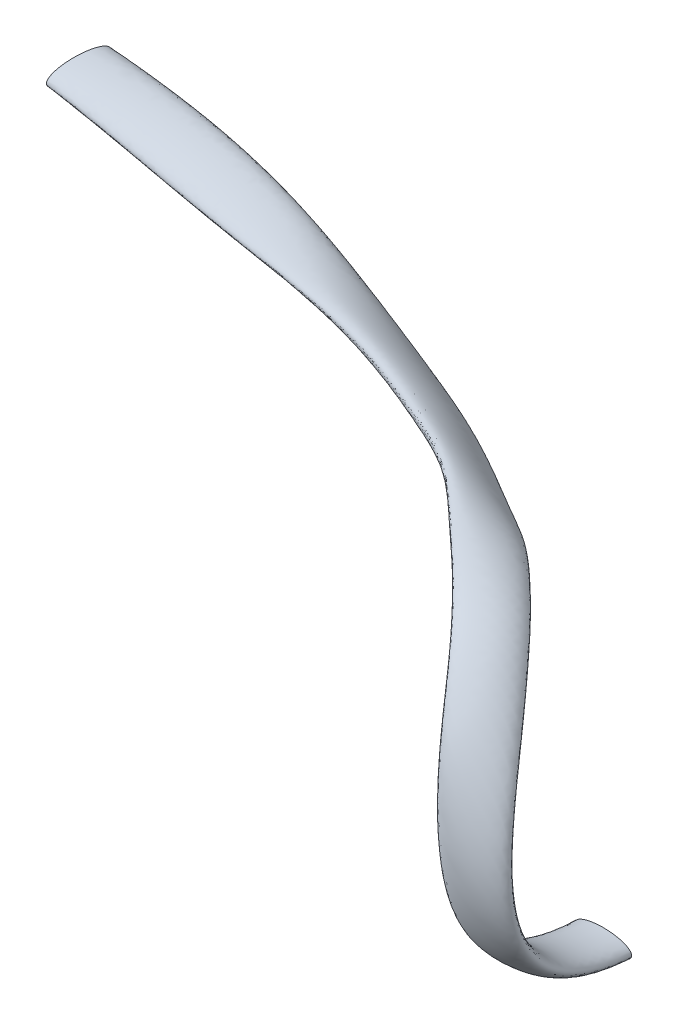
ISO-10303-21;
HEADER;
FILE_DESCRIPTION(('STEP AP214'),'2;1');
FILE_NAME('part.step','',(''),(''),'','','');
FILE_SCHEMA(('AUTOMOTIVE_DESIGN { 1 0 10303 214 1 1 1 1 }'));
ENDSEC;
DATA;
#1=APPLICATION_CONTEXT('core data for automotive mechanical design processes');
#2=APPLICATION_PROTOCOL_DEFINITION('international standard','automotive_design',2000,#1);
#3=PRODUCT_CONTEXT('',#1,'mechanical');
#4=PRODUCT('Part','Part','',(#3));
#5=PRODUCT_RELATED_PRODUCT_CATEGORY('part','',(#4));
#6=PRODUCT_DEFINITION_FORMATION('','',#4);
#7=PRODUCT_DEFINITION_CONTEXT('part definition',#1,'design');
#8=PRODUCT_DEFINITION('design','',#6,#7);
#9=PRODUCT_DEFINITION_SHAPE('','',#8);
#10=(LENGTH_UNIT() NAMED_UNIT(*) SI_UNIT(.MILLI.,.METRE.));
#11=(NAMED_UNIT(*) PLANE_ANGLE_UNIT() SI_UNIT($,.RADIAN.));
#12=(NAMED_UNIT(*) SI_UNIT($,.STERADIAN.) SOLID_ANGLE_UNIT());
#13=UNCERTAINTY_MEASURE_WITH_UNIT(LENGTH_MEASURE(1.E-05),#10,'distance_accuracy_value','');
#14=(GEOMETRIC_REPRESENTATION_CONTEXT(3) GLOBAL_UNCERTAINTY_ASSIGNED_CONTEXT((#13)) GLOBAL_UNIT_ASSIGNED_CONTEXT((#10,
#11,#12)) REPRESENTATION_CONTEXT('',''));
#15=CARTESIAN_POINT('',(0.,0.,0.));
#16=DIRECTION('',(0.,0.,1.));
#17=DIRECTION('',(1.,0.,0.));
#18=AXIS2_PLACEMENT_3D('',#15,#16,#17);
#19=CARTESIAN_POINT('',(-98.4710600412408,72.1116387856731,-23.8005636859013));
#20=DIRECTION('',(-0.986891211432256,-0.00790768827353383,-0.161193068287511));
#21=DIRECTION('',(0.159074192541011,0.120821178576729,-0.979845724629523));
#22=AXIS2_PLACEMENT_3D('',#19,#20,#21);
#23=PLANE('',#22);
#24=CARTESIAN_POINT('',(-98.4710600412408,72.1116387856731,-23.8005636859013));
#25=DIRECTION('',(-0.986891211432256,-0.00790768827353383,-0.161193068287511));
#26=DIRECTION('',(0.159074192541011,0.120821178576729,-0.979845724629523));
#27=AXIS2_PLACEMENT_3D('',#24,#25,#26);
#28=ELLIPSE('',#27,3.35,1.2);
#29=CARTESIAN_POINT('',(-97.9381614962285,72.5163897339051,-27.0830468634102));
#30=VERTEX_POINT('',#29);
#31=EDGE_CURVE('E51',#30,#30,#28,.T.);
#32=ORIENTED_EDGE('',*,*,#31,.T.);
#33=EDGE_LOOP('',(#32));
#34=FACE_BOUND('',#33,.T.);
#35=ADVANCED_FACE('F48',(#34),#23,.T.);
#36=CARTESIAN_POINT('',(-7.39881870214346,43.1180856421763,5.40326304116063));
#37=DIRECTION('',(0.,0.,1.));
#38=DIRECTION('',(1.,0.,0.));
#39=AXIS2_PLACEMENT_3D('',#36,#37,#38);
#40=PLANE('',#39);
#41=CARTESIAN_POINT('',(-7.39881870214346,43.1180856421763,5.40326304116063));
#42=DIRECTION('',(0.,0.,1.));
#43=DIRECTION('',(1.,0.,0.));
#44=AXIS2_PLACEMENT_3D('',#41,#42,#43);
#45=ELLIPSE('',#44,3.35,1.2);
#46=CARTESIAN_POINT('',(-4.04881870214346,43.1180856421763,5.40326304116063));
#47=VERTEX_POINT('',#46);
#48=EDGE_CURVE('E11',#47,#47,#45,.T.);
#49=ORIENTED_EDGE('',*,*,#48,.F.);
#50=EDGE_LOOP('',(#49));
#51=FACE_BOUND('',#50,.T.);
#52=ADVANCED_FACE('F63',(#51),#40,.F.);
#53=CARTESIAN_POINT('',(-4.04881870214346,43.1180856421763,5.40326304116063));
#54=CARTESIAN_POINT('',(-4.04790304672891,43.1995874366206,6.49403205994819));
#55=CARTESIAN_POINT('',(-4.04090542360976,43.4857468819717,8.52930119733198));
#56=CARTESIAN_POINT('',(-4.0239376484605,44.2494723489304,11.1513548488344));
#57=CARTESIAN_POINT('',(-4.00809687850553,45.3115856718272,13.3652883025508));
#58=CARTESIAN_POINT('',(-4.00075943895695,46.7836265249998,15.3929463140483));
#59=CARTESIAN_POINT('',(-4.01755299094556,48.7274087324426,17.0971202641994));
#60=CARTESIAN_POINT('',(-4.08760298335828,51.1701684692643,18.3433307593189));
#61=CARTESIAN_POINT('',(-4.2568687850632,54.2963837657828,19.1278123324529));
#62=CARTESIAN_POINT('',(-4.61953910176337,58.1121609212547,19.131099864098));
#63=CARTESIAN_POINT('',(-5.36168051606736,62.4070394760507,18.0977773158411));
#64=CARTESIAN_POINT('',(-6.52804337543739,66.3958090706136,16.3040364258152));
#65=CARTESIAN_POINT('',(-7.96540973077032,69.5785492264071,14.2711343165491));
#66=CARTESIAN_POINT('',(-9.3403350527578,71.6182980024509,12.5238460235062));
#67=CARTESIAN_POINT('',(-10.3632936283289,72.8115532818705,11.2988353596514));
#68=CARTESIAN_POINT('',(-11.4454169828597,73.8448161151245,10.0604447308844));
#69=CARTESIAN_POINT('',(-12.8729198954844,74.8424837472701,8.5111834893455));
#70=CARTESIAN_POINT('',(-15.5712387254173,75.745171118941,5.87487709834254));
#71=CARTESIAN_POINT('',(-19.4379416392196,75.8854526875904,2.36831005173974));
#72=CARTESIAN_POINT('',(-26.6690677702216,73.3699749724159,-2.29534111820622));
#73=CARTESIAN_POINT('',(-32.5237540963341,72.0933947445612,-6.52119030152289));
#74=CARTESIAN_POINT('',(-40.4555369216009,70.7237767038923,-11.3529703500677));
#75=CARTESIAN_POINT('',(-52.7027506022324,69.0697655073866,-17.3847094632079));
#76=CARTESIAN_POINT('',(-72.2676093216712,73.3780003872624,-23.2888434957498));
#77=CARTESIAN_POINT('',(-88.9962043553098,73.3891674348005,-25.6104302487991));
#78=CARTESIAN_POINT('',(-97.9381614962285,72.5163897339051,-27.0830468634102));
#79=CARTESIAN_POINT('',(-4.04881870214346,45.5180856421763,5.40326304116063));
#80=CARTESIAN_POINT('',(-4.06074683442953,45.5962658667274,6.3939124565532));
#81=CARTESIAN_POINT('',(-4.07943678671162,45.8757821722922,8.22894238714701));
#82=CARTESIAN_POINT('',(-4.10627553906754,46.5670358173507,10.4950399464211));
#83=CARTESIAN_POINT('',(-4.13867114926125,47.4868307141122,12.3299051255535));
#84=CARTESIAN_POINT('',(-4.1903177567737,48.7089954320435,13.9405304471665));
#85=CARTESIAN_POINT('',(-4.27884177839107,50.273785782629,15.2489005835556));
#86=CARTESIAN_POINT('',(-4.43897594583726,52.244036942738,16.2040663095639));
#87=CARTESIAN_POINT('',(-4.7367084429901,54.8353717299739,16.8143291684266));
#88=CARTESIAN_POINT('',(-5.29765945492308,58.1208354370379,16.8031262814202));
#89=CARTESIAN_POINT('',(-6.34324947154802,61.9239487921155,15.9329311467757));
#90=CARTESIAN_POINT('',(-7.82909573886861,65.4929960226529,14.4657731348484));
#91=CARTESIAN_POINT('',(-9.45142427044152,68.3233285704474,12.831121884739));
#92=CARTESIAN_POINT('',(-10.8626235280672,70.08316525584,11.4544856681239));
#93=CARTESIAN_POINT('',(-11.8046060479717,71.064032770909,10.4948201272256));
#94=CARTESIAN_POINT('',(-12.7563785930748,71.8968964980001,9.51314762568145));
#95=CARTESIAN_POINT('',(-13.9637879543736,72.7044027822872,8.24192206766266));
#96=CARTESIAN_POINT('',(-16.3642241708608,73.4666875999444,6.06112871258147));
#97=CARTESIAN_POINT('',(-19.9361990210673,73.5583787067187,2.94314656463212));
#98=CARTESIAN_POINT('',(-27.5756795156112,71.6963136068423,-0.675524074748975));
#99=CARTESIAN_POINT('',(-33.1910712909738,70.2834145565798,-5.08446190726914));
#100=CARTESIAN_POINT('',(-40.9764275088423,68.7974555340761,-10.0203767373697));
#101=CARTESIAN_POINT('',(-53.3071906541005,67.1031443750012,-15.9367995297578));
#102=CARTESIAN_POINT('',(-72.3573353819806,70.8819220285894,-24.1938913409789));
#103=CARTESIAN_POINT('',(-88.982554880423,70.968912849039,-26.1008799841399));
#104=CARTESIAN_POINT('',(-97.8728242537435,70.1340470345993,-27.3661975438069));
#105=CARTESIAN_POINT('',(-10.7488187021435,45.5180856421763,5.40326304116063));
#106=CARTESIAN_POINT('',(-10.7605691615213,45.5612880372418,6.40845012354165));
#107=CARTESIAN_POINT('',(-10.7789037679868,45.7708486838353,8.27255538811234));
#108=CARTESIAN_POINT('',(-10.8024674606614,46.3585482366634,10.6084954692129));
#109=CARTESIAN_POINT('',(-10.8289624307304,47.1797821787245,12.5361157903219));
#110=CARTESIAN_POINT('',(-10.8701276970657,48.3010334078825,14.2796885187727));
#111=CARTESIAN_POINT('',(-10.9405337814699,49.7682332185209,15.77575894385));
#112=CARTESIAN_POINT('',(-11.0675274532681,51.650874512131,17.000840038032));
#113=CARTESIAN_POINT('',(-11.2989599396374,54.1716359796994,18.0273457368437));
#114=CARTESIAN_POINT('',(-11.7168250005403,57.4542880243675,18.6769793738787));
#115=CARTESIAN_POINT('',(-12.4217032849705,61.4623945171933,18.7995262814195));
#116=CARTESIAN_POINT('',(-13.3294347234519,65.5124024161927,18.358348408043));
#117=CARTESIAN_POINT('',(-14.3578401176456,68.9197069369003,17.3868734611754));
#118=CARTESIAN_POINT('',(-15.3609043960661,71.1712103914879,16.3048785270877));
#119=CARTESIAN_POINT('',(-16.1528699487507,72.3854218484463,15.4194788502038));
#120=CARTESIAN_POINT('',(-17.0236829707986,73.3824411555919,14.4603047492047));
#121=CARTESIAN_POINT('',(-18.232105714791,74.2673958304107,13.1685790194988));
#122=CARTESIAN_POINT('',(-20.5593321922517,75.3276454344226,10.9290820847554));
#123=CARTESIAN_POINT('',(-24.1130060769936,75.6808983692557,7.8771348515857));
#124=CARTESIAN_POINT('',(-31.0676985602978,76.7539082578933,2.5833297966785));
#125=CARTESIAN_POINT('',(-36.6416049164395,74.5976673197127,-1.24822852956234));
#126=CARTESIAN_POINT('',(-44.0123967093258,72.7269701495335,-5.51754152863838));
#127=CARTESIAN_POINT('',(-55.1104322591266,71.5725566744278,-10.6787206891939));
#128=CARTESIAN_POINT('',(-73.6294761290503,68.3981582467027,-17.2980527046282));
#129=CARTESIAN_POINT('',(-90.1171331894627,69.6013236574341,-19.4256228686778));
#130=CARTESIAN_POINT('',(-98.9386213437683,69.3245451381352,-20.801231188789));
#131=CARTESIAN_POINT('',(-10.7488187021435,43.1180856421763,5.40326304116063));
#132=CARTESIAN_POINT('',(-10.7477253738206,43.164609607135,6.50856972693663));
#133=CARTESIAN_POINT('',(-10.7403724048849,43.3808133935148,8.5729141982973));
#134=CARTESIAN_POINT('',(-10.7201295700544,44.0409847682431,11.2648103716263));
#135=CARTESIAN_POINT('',(-10.6983881599747,45.0045371364395,13.5714989673192));
#136=CARTESIAN_POINT('',(-10.680569379249,46.3756645008388,15.7321043856546));
#137=CARTESIAN_POINT('',(-10.6792449940244,48.2218561683344,17.6239786244938));
#138=CARTESIAN_POINT('',(-10.7161544907891,50.5770060386574,19.140104487787));
#139=CARTESIAN_POINT('',(-10.8191202817105,53.6326480155082,20.3408289008701));
#140=CARTESIAN_POINT('',(-11.0387046473806,57.4456135085842,21.0049529565565));
#141=CARTESIAN_POINT('',(-11.4401343294898,61.9454852011285,20.9643724504849));
#142=CARTESIAN_POINT('',(-12.0283823600207,66.4152154641534,20.1966116990099));
#143=CARTESIAN_POINT('',(-12.8718255779744,70.17492759286,18.8268858929855));
#144=CARTESIAN_POINT('',(-13.8386159207567,72.7063431380989,17.37423888247));
#145=CARTESIAN_POINT('',(-14.7115575291079,74.1329423594078,16.2234940826296));
#146=CARTESIAN_POINT('',(-15.7127213605835,75.3303607727162,15.0076018544077));
#147=CARTESIAN_POINT('',(-17.1412376559018,76.4054767953936,13.4378404411817));
#148=CARTESIAN_POINT('',(-19.7663467468081,77.6061289534192,10.7428304705165));
#149=CARTESIAN_POINT('',(-23.6147486951459,78.0079723501273,7.30229833869333));
#150=CARTESIAN_POINT('',(-30.1610868149083,78.4275696234669,0.96351275322125));
#151=CARTESIAN_POINT('',(-35.9742877217998,76.4076475076941,-2.6849569238161));
#152=CARTESIAN_POINT('',(-43.4915061220843,74.6532913193496,-6.85013514133634));
#153=CARTESIAN_POINT('',(-54.5059922072585,73.5391778068132,-12.126630622644));
#154=CARTESIAN_POINT('',(-73.5397500687409,70.8942366053757,-16.3930048593991));
#155=CARTESIAN_POINT('',(-90.1307826643496,72.0215782431956,-18.9351731333369));
#156=CARTESIAN_POINT('',(-99.0039585862533,71.706887837441,-20.5180805083924));
#157=CARTESIAN_POINT('',(-10.7488187021435,40.7180856421763,5.40326304116063));
#158=CARTESIAN_POINT('',(-10.73488158612,40.7679311770281,6.60868933033162));
#159=CARTESIAN_POINT('',(-10.7018410417831,40.9907781031943,8.87327300848226));
#160=CARTESIAN_POINT('',(-10.6377916794473,41.7234212998228,11.9211252740397));
#161=CARTESIAN_POINT('',(-10.567813889219,42.8292920941544,14.6068821443165));
#162=CARTESIAN_POINT('',(-10.4910110614322,44.4502955937952,17.1845202525365));
#163=CARTESIAN_POINT('',(-10.4179562065789,46.675479118148,19.4721983051375));
#164=CARTESIAN_POINT('',(-10.3647815283102,49.5031375651837,21.279368937542));
#165=CARTESIAN_POINT('',(-10.3392806237836,53.0936600513171,22.6543120648964));
#166=CARTESIAN_POINT('',(-10.3605842942209,57.436938992801,23.3329265392342));
#167=CARTESIAN_POINT('',(-10.4585653740092,62.4285758850638,23.1292186195504));
#168=CARTESIAN_POINT('',(-10.7273299965895,67.3180285121141,22.0348749899767));
#169=CARTESIAN_POINT('',(-11.3858110383032,71.4301482488197,20.2668983247956));
#170=CARTESIAN_POINT('',(-12.3163274454472,74.2414758847098,18.4435992378523));
#171=CARTESIAN_POINT('',(-13.2702451094651,75.8804628703692,17.0275093150555));
#172=CARTESIAN_POINT('',(-14.4017597503684,77.2782803898405,15.5548989596107));
#173=CARTESIAN_POINT('',(-16.0503695970126,78.5435577603766,13.7071018628645));
#174=CARTESIAN_POINT('',(-18.9733613013645,79.8846124724158,10.5565788562776));
#175=CARTESIAN_POINT('',(-23.1164913132982,80.3350463309989,6.72746182580095));
#176=CARTESIAN_POINT('',(-29.2544750695188,80.1012309890405,-0.656304290235991));
#177=CARTESIAN_POINT('',(-35.3069705271601,78.2176276956755,-4.12168531806985));
#178=CARTESIAN_POINT('',(-42.9706155348429,76.5796124891659,-8.1827287540343));
#179=CARTESIAN_POINT('',(-53.9015521553904,75.5057989391986,-13.5745405560941));
#180=CARTESIAN_POINT('',(-73.4500240084315,73.3903149640486,-15.48795701417));
#181=CARTESIAN_POINT('',(-90.1444321392364,74.441832828957,-18.4447233979961));
#182=CARTESIAN_POINT('',(-99.0692958287383,74.0892305367467,-20.2349298279957));
#183=CARTESIAN_POINT('',(-4.04881870214346,40.7180856421763,5.40326304116063));
#184=CARTESIAN_POINT('',(-4.03505925902828,40.8029090065137,6.59415166334318));
#185=CARTESIAN_POINT('',(-4.00237406050789,41.0957115916512,8.82966000751694));
#186=CARTESIAN_POINT('',(-3.94159975785346,41.93190888051,11.8076697512478));
#187=CARTESIAN_POINT('',(-3.87752260774981,43.1363406295421,14.4006714795481));
#188=CARTESIAN_POINT('',(-3.81120112114021,44.8582576179562,16.8453621809302));
#189=CARTESIAN_POINT('',(-3.75626420350006,47.1810316822561,18.9453399448432));
#190=CARTESIAN_POINT('',(-3.73623002087929,50.0962999957907,20.4825952090739));
#191=CARTESIAN_POINT('',(-3.7770291271363,53.7573958015917,21.4412954964792));
#192=CARTESIAN_POINT('',(-3.94141874860365,58.1034864054715,21.4590734467757));
#193=CARTESIAN_POINT('',(-4.3801115605867,62.890130159986,20.2626234849066));
#194=CARTESIAN_POINT('',(-5.22699101200618,67.2986221185742,18.1422997167821));
#195=CARTESIAN_POINT('',(-6.4793951910991,70.8337698823668,15.7111467483592));
#196=CARTESIAN_POINT('',(-7.81804657744836,73.1534307490619,13.5932063788885));
#197=CARTESIAN_POINT('',(-8.92198120868606,74.559073792832,12.1028505920773));
#198=CARTESIAN_POINT('',(-10.1344553726446,75.7927357322488,10.6077418360874));
#199=CARTESIAN_POINT('',(-11.7820518365952,76.9805647122531,8.78044491102835));
#200=CARTESIAN_POINT('',(-14.7782532799737,78.0236546379376,5.6886254841036));
#201=CARTESIAN_POINT('',(-18.9396842573719,78.212526668462,1.79347353884737));
#202=CARTESIAN_POINT('',(-25.7624560248321,75.0436363379895,-3.91515816166348));
#203=CARTESIAN_POINT('',(-31.8564369016943,73.9033749325426,-7.95791869577665));
#204=CARTESIAN_POINT('',(-39.9346463343595,72.6500978737085,-12.6855639627656));
#205=CARTESIAN_POINT('',(-52.0983105503643,71.036386639772,-18.832619396658));
#206=CARTESIAN_POINT('',(-72.1778832613618,75.8740787459353,-22.3837956505207));
#207=CARTESIAN_POINT('',(-89.0098538301967,75.809422020562,-25.1199805134582));
#208=CARTESIAN_POINT('',(-98.0034987387135,74.8987324332108,-26.7998961830135));
#209=CARTESIAN_POINT('',(-4.04881870214346,43.1180856421763,5.40326304116063));
#210=CARTESIAN_POINT('',(-4.04790304672891,43.1995874366206,6.49403205994819));
#211=CARTESIAN_POINT('',(-4.04090542360976,43.4857468819717,8.52930119733198));
#212=CARTESIAN_POINT('',(-4.0239376484605,44.2494723489304,11.1513548488344));
#213=CARTESIAN_POINT('',(-4.00809687850553,45.3115856718272,13.3652883025508));
#214=CARTESIAN_POINT('',(-4.00075943895695,46.7836265249998,15.3929463140483));
#215=CARTESIAN_POINT('',(-4.01755299094556,48.7274087324426,17.0971202641994));
#216=CARTESIAN_POINT('',(-4.08760298335828,51.1701684692643,18.3433307593189));
#217=CARTESIAN_POINT('',(-4.2568687850632,54.2963837657828,19.1278123324529));
#218=CARTESIAN_POINT('',(-4.61953910176337,58.1121609212547,19.131099864098));
#219=CARTESIAN_POINT('',(-5.36168051606736,62.4070394760507,18.0977773158411));
#220=CARTESIAN_POINT('',(-6.52804337543739,66.3958090706136,16.3040364258152));
#221=CARTESIAN_POINT('',(-7.96540973077032,69.5785492264071,14.2711343165491));
#222=CARTESIAN_POINT('',(-9.3403350527578,71.6182980024509,12.5238460235062));
#223=CARTESIAN_POINT('',(-10.3632936283289,72.8115532818705,11.2988353596514));
#224=CARTESIAN_POINT('',(-11.4454169828597,73.8448161151245,10.0604447308844));
#225=CARTESIAN_POINT('',(-12.8729198954844,74.8424837472701,8.5111834893455));
#226=CARTESIAN_POINT('',(-15.5712387254173,75.745171118941,5.87487709834254));
#227=CARTESIAN_POINT('',(-19.4379416392196,75.8854526875904,2.36831005173974));
#228=CARTESIAN_POINT('',(-26.6690677702216,73.3699749724159,-2.29534111820622));
#229=CARTESIAN_POINT('',(-32.5237540963341,72.0933947445612,-6.52119030152289));
#230=CARTESIAN_POINT('',(-40.4555369216009,70.7237767038923,-11.3529703500677));
#231=CARTESIAN_POINT('',(-52.7027506022324,69.0697655073866,-17.3847094632079));
#232=CARTESIAN_POINT('',(-72.2676093216712,73.3780003872624,-23.2888434957498));
#233=CARTESIAN_POINT('',(-88.9962043553098,73.3891674348005,-25.6104302487991));
#234=CARTESIAN_POINT('',(-97.9381614962285,72.5163897339051,-27.0830468634102));
#235=(BOUNDED_SURFACE() B_SPLINE_SURFACE(3,3,((#53,#54,#55,#56,#57,#58,#59,#60,#61,#62,#63,#64,
#65,#66,#67,#68,#69,#70,#71,#72,#73,#74,#75,#76,#77,#78),(#79,#80,#81,#82,#83,#84,#85,#86,#87,
#88,#89,#90,#91,#92,#93,#94,#95,#96,#97,#98,#99,#100,#101,#102,#103,#104),(#105,#106,#107,#108,
#109,#110,#111,#112,#113,#114,#115,#116,#117,#118,#119,#120,#121,#122,#123,#124,#125,#126,#127,
#128,#129,#130),(#131,#132,#133,#134,#135,#136,#137,#138,#139,#140,#141,#142,#143,#144,#145,
#146,#147,#148,#149,#150,#151,#152,#153,#154,#155,#156),(#157,#158,#159,#160,#161,#162,#163,
#164,#165,#166,#167,#168,#169,#170,#171,#172,#173,#174,#175,#176,#177,#178,#179,#180,#181,#182),
(#183,#184,#185,#186,#187,#188,#189,#190,#191,#192,#193,#194,#195,#196,#197,#198,#199,#200,#201,
#202,#203,#204,#205,#206,#207,#208),(#209,#210,#211,#212,#213,#214,#215,#216,#217,#218,#219,
#220,#221,#222,#223,#224,#225,#226,#227,#228,#229,#230,#231,#232,#233,#234)),.UNSPECIFIED.,.T.,
.F.,.F.) B_SPLINE_SURFACE_WITH_KNOTS((4,3,4),(4,1,1,1,1,1,1,1,1,1,1,1,1,1,1,1,1,1,1,1,1,1,1,4),
(0.,0.5,1.),(0.,0.015625,0.03125,0.0468749999999994,0.0624999999999996,0.08333333333333,
0.104166666666667,0.125,0.156250000000007,0.1875,0.21875,0.249999999999986,0.2734375,
0.286566586619218,0.296875,0.320312500000015,0.343750000000094,0.390625,0.4375,0.52820823106808,
0.53125,0.625,0.8125,1.),
.UNSPECIFIED.) GEOMETRIC_REPRESENTATION_ITEM() RATIONAL_B_SPLINE_SURFACE(((1.,1.,1.,1.,1.,1.,1.,
1.,1.,1.,1.,1.,1.,1.,1.,1.,1.,1.,1.,1.,1.,1.,1.,1.,1.,1.),(0.333333333333333,0.333333333333333,
0.333333333333333,0.333333333333333,0.333333333333333,0.333333333333333,0.333333333333333,
0.333333333333333,0.333333333333333,0.333333333333333,0.333333333333333,0.333333333333333,
0.333333333333333,0.333333333333333,0.333333333333333,0.333333333333333,0.333333333333333,
0.333333333333333,0.333333333333333,0.333333333333334,0.333333333333333,0.333333333333333,
0.333333333333333,0.333333333333333,0.333333333333333,0.333333333333333),(0.333333333333333,
0.333333333333333,0.333333333333333,0.333333333333333,0.333333333333333,0.333333333333333,
0.333333333333333,0.333333333333333,0.333333333333333,0.333333333333333,0.333333333333333,
0.333333333333333,0.333333333333333,0.333333333333333,0.333333333333333,0.333333333333333,
0.333333333333333,0.333333333333333,0.333333333333333,0.333333333333334,0.333333333333333,
0.333333333333333,0.333333333333333,0.333333333333333,0.333333333333333,0.333333333333333),(1.,
1.,1.,1.,1.,1.,1.,1.,1.,1.,1.,1.,1.,1.,1.,1.,1.,1.,1.,1.,1.,1.,1.,1.,1.,1.),(0.333333333333333,
0.333333333333333,0.333333333333333,0.333333333333333,0.333333333333333,0.333333333333333,
0.333333333333333,0.333333333333333,0.333333333333333,0.333333333333333,0.333333333333333,
0.333333333333333,0.333333333333333,0.333333333333333,0.333333333333333,0.333333333333333,
0.333333333333333,0.333333333333333,0.333333333333333,0.333333333333334,0.333333333333333,
0.333333333333333,0.333333333333333,0.333333333333333,0.333333333333333,0.333333333333333),
(0.333333333333333,0.333333333333333,0.333333333333333,0.333333333333333,0.333333333333333,
0.333333333333333,0.333333333333333,0.333333333333333,0.333333333333333,0.333333333333333,
0.333333333333333,0.333333333333333,0.333333333333333,0.333333333333333,0.333333333333333,
0.333333333333333,0.333333333333333,0.333333333333333,0.333333333333333,0.333333333333334,
0.333333333333333,0.333333333333333,0.333333333333333,0.333333333333333,0.333333333333333,
0.333333333333333),(1.,1.,1.,1.,1.,1.,1.,1.,1.,1.,1.,1.,1.,1.,1.,1.,1.,1.,1.,1.,1.,1.,1.,1.,1.,1.))) REPRESENTATION_ITEM('') SURFACE());
#236=ORIENTED_EDGE('',*,*,#48,.T.);
#237=EDGE_LOOP('',(#236));
#238=FACE_BOUND('',#237,.T.);
#239=ORIENTED_EDGE('',*,*,#31,.F.);
#240=EDGE_LOOP('',(#239));
#241=FACE_BOUND('',#240,.T.);
#242=ADVANCED_FACE('F61',(#238,#241),#235,.T.);
#243=CLOSED_SHELL('',(#35,#52,#242));
#244=MANIFOLD_SOLID_BREP('B2',#243);
#245=ADVANCED_BREP_SHAPE_REPRESENTATION('',(#18,#244),#14);
#246=SHAPE_DEFINITION_REPRESENTATION(#9,#245);
ENDSEC;
END-ISO-10303-21;
